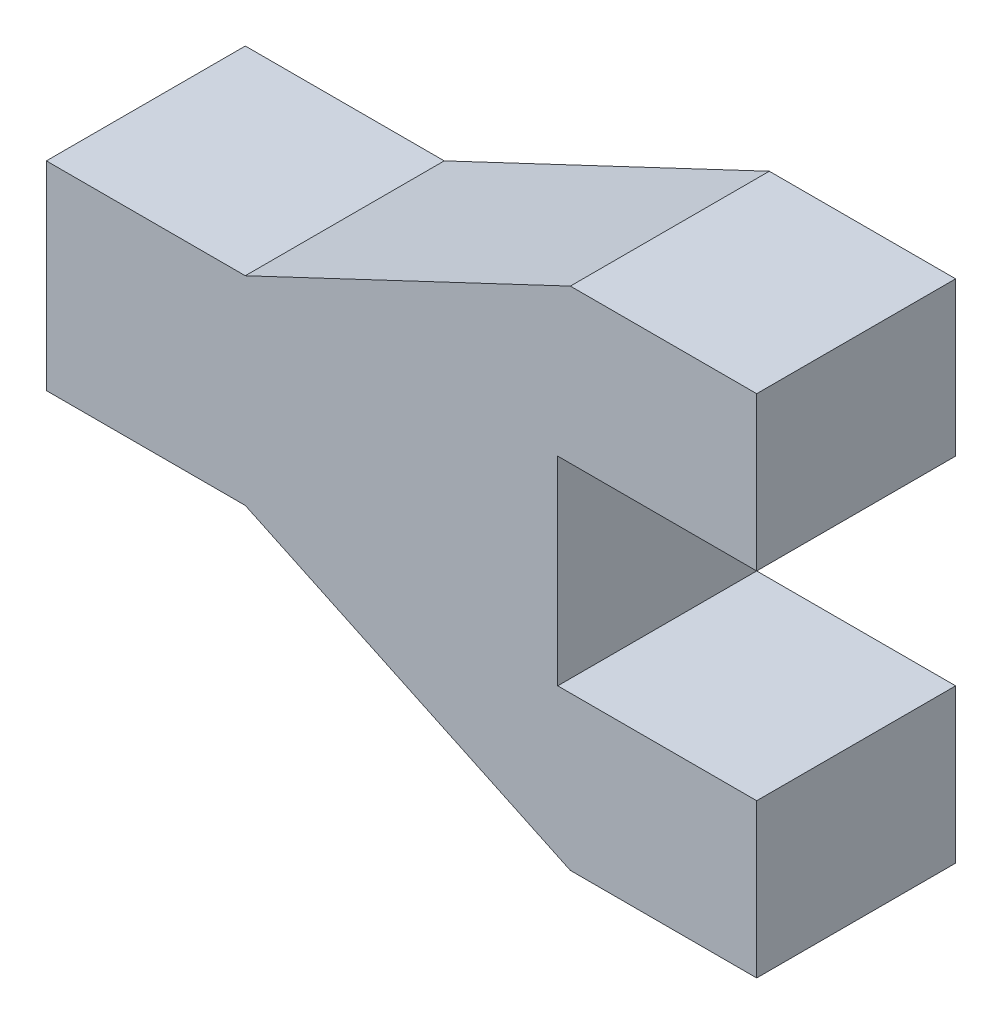
ISO-10303-21;
HEADER;
FILE_DESCRIPTION(('STEP AP214'),'2;1');
FILE_NAME('part.step','',(''),(''),'','','');
FILE_SCHEMA(('AUTOMOTIVE_DESIGN { 1 0 10303 214 1 1 1 1 }'));
ENDSEC;
DATA;
#1=APPLICATION_CONTEXT('core data for automotive mechanical design processes');
#2=APPLICATION_PROTOCOL_DEFINITION('international standard','automotive_design',2000,#1);
#3=PRODUCT_CONTEXT('',#1,'mechanical');
#4=PRODUCT('Part','Part','',(#3));
#5=PRODUCT_RELATED_PRODUCT_CATEGORY('part','',(#4));
#6=PRODUCT_DEFINITION_FORMATION('','',#4);
#7=PRODUCT_DEFINITION_CONTEXT('part definition',#1,'design');
#8=PRODUCT_DEFINITION('design','',#6,#7);
#9=PRODUCT_DEFINITION_SHAPE('','',#8);
#10=(LENGTH_UNIT() NAMED_UNIT(*) SI_UNIT(.MILLI.,.METRE.));
#11=(NAMED_UNIT(*) PLANE_ANGLE_UNIT() SI_UNIT($,.RADIAN.));
#12=(NAMED_UNIT(*) SI_UNIT($,.STERADIAN.) SOLID_ANGLE_UNIT());
#13=UNCERTAINTY_MEASURE_WITH_UNIT(LENGTH_MEASURE(1.E-05),#10,'distance_accuracy_value','');
#14=(GEOMETRIC_REPRESENTATION_CONTEXT(3) GLOBAL_UNCERTAINTY_ASSIGNED_CONTEXT((#13)) GLOBAL_UNIT_ASSIGNED_CONTEXT((#10,
#11,#12)) REPRESENTATION_CONTEXT('',''));
#15=CARTESIAN_POINT('',(0.,0.,0.));
#16=DIRECTION('',(0.,0.,1.));
#17=DIRECTION('',(1.,0.,0.));
#18=AXIS2_PLACEMENT_3D('',#15,#16,#17);
#19=CARTESIAN_POINT('',(64.9582859778661,0.,1.524));
#20=DIRECTION('',(0.,1.,0.));
#21=DIRECTION('',(0.,0.,1.));
#22=AXIS2_PLACEMENT_3D('',#19,#20,#21);
#23=PLANE('',#22);
#24=DIRECTION('',(1.,0.,0.));
#25=VECTOR('',#24,1.);
#26=CARTESIAN_POINT('',(64.9582859778661,0.,0.));
#27=LINE('',#26,#25);
#28=CARTESIAN_POINT('',(64.9582859778661,0.,0.));
#29=VERTEX_POINT('',#28);
#30=CARTESIAN_POINT('',(66.4822859778661,0.,0.));
#31=VERTEX_POINT('',#30);
#32=EDGE_CURVE('E152',#29,#31,#27,.T.);
#33=ORIENTED_EDGE('',*,*,#32,.T.);
#34=DIRECTION('',(0.,0.,-1.));
#35=VECTOR('',#34,1.);
#36=CARTESIAN_POINT('',(66.4822859778661,0.,1.524));
#37=LINE('',#36,#35);
#38=CARTESIAN_POINT('',(66.4822859778661,0.,1.524));
#39=VERTEX_POINT('',#38);
#40=EDGE_CURVE('E11',#39,#31,#37,.T.);
#41=ORIENTED_EDGE('',*,*,#40,.F.);
#42=DIRECTION('',(1.,0.,0.));
#43=VECTOR('',#42,1.);
#44=CARTESIAN_POINT('',(64.9582859778661,0.,1.524));
#45=LINE('',#44,#43);
#46=CARTESIAN_POINT('',(64.9582859778661,0.,1.524));
#47=VERTEX_POINT('',#46);
#48=EDGE_CURVE('E174',#47,#39,#45,.T.);
#49=ORIENTED_EDGE('',*,*,#48,.F.);
#50=DIRECTION('',(0.,0.,-1.));
#51=VECTOR('',#50,1.);
#52=CARTESIAN_POINT('',(64.9582859778661,0.,1.524));
#53=LINE('',#52,#51);
#54=EDGE_CURVE('E148',#47,#29,#53,.T.);
#55=ORIENTED_EDGE('',*,*,#54,.T.);
#56=EDGE_LOOP('',(#33,#41,#49,#55));
#57=FACE_BOUND('',#56,.T.);
#58=ADVANCED_FACE('F32',(#57),#23,.F.);
#59=CARTESIAN_POINT('',(66.4822859778661,0.,1.524));
#60=DIRECTION('',(-1.,0.,0.));
#61=DIRECTION('',(0.,0.,1.));
#62=AXIS2_PLACEMENT_3D('',#59,#60,#61);
#63=PLANE('',#62);
#64=DIRECTION('',(0.,1.,0.));
#65=VECTOR('',#64,1.);
#66=CARTESIAN_POINT('',(66.4822859778661,0.,0.));
#67=LINE('',#66,#65);
#68=CARTESIAN_POINT('',(66.4822859778661,1.17612480615378,0.));
#69=VERTEX_POINT('',#68);
#70=EDGE_CURVE('E155',#31,#69,#67,.T.);
#71=ORIENTED_EDGE('',*,*,#70,.T.);
#72=DIRECTION('',(0.,0.,-1.));
#73=VECTOR('',#72,1.);
#74=CARTESIAN_POINT('',(66.4822859778661,1.17612480615378,1.524));
#75=LINE('',#74,#73);
#76=CARTESIAN_POINT('',(66.4822859778661,1.17612480615378,1.524));
#77=VERTEX_POINT('',#76);
#78=EDGE_CURVE('E40',#77,#69,#75,.T.);
#79=ORIENTED_EDGE('',*,*,#78,.F.);
#80=DIRECTION('',(0.,1.,0.));
#81=VECTOR('',#80,1.);
#82=CARTESIAN_POINT('',(66.4822859778661,0.,1.524));
#83=LINE('',#82,#81);
#84=EDGE_CURVE('E103',#39,#77,#83,.T.);
#85=ORIENTED_EDGE('',*,*,#84,.F.);
#86=ORIENTED_EDGE('',*,*,#40,.T.);
#87=EDGE_LOOP('',(#71,#79,#85,#86));
#88=FACE_BOUND('',#87,.T.);
#89=ADVANCED_FACE('F252',(#88),#63,.F.);
#90=CARTESIAN_POINT('',(65.05492565956,1.17612480615378,1.524));
#91=DIRECTION('',(0.,-1.,0.));
#92=DIRECTION('',(0.,0.,-1.));
#93=AXIS2_PLACEMENT_3D('',#90,#91,#92);
#94=PLANE('',#93);
#95=DIRECTION('',(-1.,0.,0.));
#96=VECTOR('',#95,1.);
#97=CARTESIAN_POINT('',(65.05492565956,1.17612480615378,0.));
#98=LINE('',#97,#96);
#99=CARTESIAN_POINT('',(65.05492565956,1.17612480615378,0.));
#100=VERTEX_POINT('',#99);
#101=EDGE_CURVE('E157',#69,#100,#98,.T.);
#102=ORIENTED_EDGE('',*,*,#101,.T.);
#103=DIRECTION('',(0.,0.,-1.));
#104=VECTOR('',#103,1.);
#105=CARTESIAN_POINT('',(65.05492565956,1.17612480615378,1.524));
#106=LINE('',#105,#104);
#107=CARTESIAN_POINT('',(65.05492565956,1.17612480615378,1.524));
#108=VERTEX_POINT('',#107);
#109=EDGE_CURVE('E193',#108,#100,#106,.T.);
#110=ORIENTED_EDGE('',*,*,#109,.F.);
#111=DIRECTION('',(-1.,0.,0.));
#112=VECTOR('',#111,1.);
#113=CARTESIAN_POINT('',(65.05492565956,1.17612480615378,1.524));
#114=LINE('',#113,#112);
#115=EDGE_CURVE('E201',#77,#108,#114,.T.);
#116=ORIENTED_EDGE('',*,*,#115,.F.);
#117=ORIENTED_EDGE('',*,*,#78,.T.);
#118=EDGE_LOOP('',(#102,#110,#116,#117));
#119=FACE_BOUND('',#118,.T.);
#120=ADVANCED_FACE('F199',(#119),#94,.F.);
#121=CARTESIAN_POINT('',(62.5651667352737,0.,1.524));
#122=DIRECTION('',(0.427126658457203,-0.904191803565584,0.));
#123=DIRECTION('',(0.904191803565584,0.427126658457203,0.));
#124=AXIS2_PLACEMENT_3D('',#121,#122,#123);
#125=PLANE('',#124);
#126=DIRECTION('',(-0.904191803565584,-0.427126658457202,0.));
#127=VECTOR('',#126,1.);
#128=CARTESIAN_POINT('',(62.5651667352737,0.,0.));
#129=LINE('',#128,#127);
#130=CARTESIAN_POINT('',(62.5651667352737,0.,0.));
#131=VERTEX_POINT('',#130);
#132=EDGE_CURVE('E159',#100,#131,#129,.T.);
#133=ORIENTED_EDGE('',*,*,#132,.T.);
#134=DIRECTION('',(0.,0.,-1.));
#135=VECTOR('',#134,1.);
#136=CARTESIAN_POINT('',(62.5651667352737,0.,1.524));
#137=LINE('',#136,#135);
#138=CARTESIAN_POINT('',(62.5651667352737,0.,1.524));
#139=VERTEX_POINT('',#138);
#140=EDGE_CURVE('E190',#139,#131,#137,.T.);
#141=ORIENTED_EDGE('',*,*,#140,.F.);
#142=DIRECTION('',(-0.904191803565584,-0.427126658457202,0.));
#143=VECTOR('',#142,1.);
#144=CARTESIAN_POINT('',(62.5651667352737,0.,1.524));
#145=LINE('',#144,#143);
#146=EDGE_CURVE('E219',#108,#139,#145,.T.);
#147=ORIENTED_EDGE('',*,*,#146,.F.);
#148=ORIENTED_EDGE('',*,*,#109,.T.);
#149=EDGE_LOOP('',(#133,#141,#147,#148));
#150=FACE_BOUND('',#149,.T.);
#151=ADVANCED_FACE('F210',(#150),#125,.F.);
#152=CARTESIAN_POINT('',(61.0411667352737,0.,1.524));
#153=DIRECTION('',(0.,-1.,0.));
#154=DIRECTION('',(1.,0.,0.));
#155=AXIS2_PLACEMENT_3D('',#152,#153,#154);
#156=PLANE('',#155);
#157=DIRECTION('',(-1.,0.,0.));
#158=VECTOR('',#157,1.);
#159=CARTESIAN_POINT('',(61.0411667352737,0.,0.));
#160=LINE('',#159,#158);
#161=CARTESIAN_POINT('',(61.0411667352737,0.,0.));
#162=VERTEX_POINT('',#161);
#163=EDGE_CURVE('E161',#131,#162,#160,.T.);
#164=ORIENTED_EDGE('',*,*,#163,.T.);
#165=DIRECTION('',(0.,0.,-1.));
#166=VECTOR('',#165,1.);
#167=CARTESIAN_POINT('',(61.0411667352737,0.,1.524));
#168=LINE('',#167,#166);
#169=CARTESIAN_POINT('',(61.0411667352737,0.,1.524));
#170=VERTEX_POINT('',#169);
#171=EDGE_CURVE('E187',#170,#162,#168,.T.);
#172=ORIENTED_EDGE('',*,*,#171,.F.);
#173=DIRECTION('',(-1.,0.,0.));
#174=VECTOR('',#173,1.);
#175=CARTESIAN_POINT('',(61.0411667352737,0.,1.524));
#176=LINE('',#175,#174);
#177=EDGE_CURVE('E216',#139,#170,#176,.T.);
#178=ORIENTED_EDGE('',*,*,#177,.F.);
#179=ORIENTED_EDGE('',*,*,#140,.T.);
#180=EDGE_LOOP('',(#164,#172,#178,#179));
#181=FACE_BOUND('',#180,.T.);
#182=ADVANCED_FACE('F214',(#181),#156,.F.);
#183=CARTESIAN_POINT('',(61.0411667352737,-1.524,1.524));
#184=DIRECTION('',(1.,0.,0.));
#185=DIRECTION('',(0.,0.,-1.));
#186=AXIS2_PLACEMENT_3D('',#183,#184,#185);
#187=PLANE('',#186);
#188=DIRECTION('',(0.,-1.,0.));
#189=VECTOR('',#188,1.);
#190=CARTESIAN_POINT('',(61.0411667352737,-1.524,0.));
#191=LINE('',#190,#189);
#192=CARTESIAN_POINT('',(61.0411667352737,-1.524,0.));
#193=VERTEX_POINT('',#192);
#194=EDGE_CURVE('E163',#162,#193,#191,.T.);
#195=ORIENTED_EDGE('',*,*,#194,.T.);
#196=DIRECTION('',(0.,0.,-1.));
#197=VECTOR('',#196,1.);
#198=CARTESIAN_POINT('',(61.0411667352737,-1.524,1.524));
#199=LINE('',#198,#197);
#200=CARTESIAN_POINT('',(61.0411667352737,-1.524,1.524));
#201=VERTEX_POINT('',#200);
#202=EDGE_CURVE('E184',#201,#193,#199,.T.);
#203=ORIENTED_EDGE('',*,*,#202,.F.);
#204=DIRECTION('',(0.,-1.,0.));
#205=VECTOR('',#204,1.);
#206=CARTESIAN_POINT('',(61.0411667352737,-1.524,1.524));
#207=LINE('',#206,#205);
#208=EDGE_CURVE('E218',#170,#201,#207,.T.);
#209=ORIENTED_EDGE('',*,*,#208,.F.);
#210=ORIENTED_EDGE('',*,*,#171,.T.);
#211=EDGE_LOOP('',(#195,#203,#209,#210));
#212=FACE_BOUND('',#211,.T.);
#213=ADVANCED_FACE('F265',(#212),#187,.F.);
#214=CARTESIAN_POINT('',(61.0411667352737,-1.524,1.524));
#215=DIRECTION('',(0.,1.,0.));
#216=DIRECTION('',(-1.,0.,0.));
#217=AXIS2_PLACEMENT_3D('',#214,#215,#216);
#218=PLANE('',#217);
#219=DIRECTION('',(1.,0.,0.));
#220=VECTOR('',#219,1.);
#221=CARTESIAN_POINT('',(61.0411667352737,-1.524,0.));
#222=LINE('',#221,#220);
#223=CARTESIAN_POINT('',(62.5651667352737,-1.524,0.));
#224=VERTEX_POINT('',#223);
#225=EDGE_CURVE('E165',#193,#224,#222,.T.);
#226=ORIENTED_EDGE('',*,*,#225,.T.);
#227=DIRECTION('',(0.,0.,-1.));
#228=VECTOR('',#227,1.);
#229=CARTESIAN_POINT('',(62.5651667352737,-1.524,1.524));
#230=LINE('',#229,#228);
#231=CARTESIAN_POINT('',(62.5651667352737,-1.524,1.524));
#232=VERTEX_POINT('',#231);
#233=EDGE_CURVE('E181',#232,#224,#230,.T.);
#234=ORIENTED_EDGE('',*,*,#233,.F.);
#235=DIRECTION('',(1.,0.,0.));
#236=VECTOR('',#235,1.);
#237=CARTESIAN_POINT('',(61.0411667352737,-1.524,1.524));
#238=LINE('',#237,#236);
#239=EDGE_CURVE('E221',#201,#232,#238,.T.);
#240=ORIENTED_EDGE('',*,*,#239,.F.);
#241=ORIENTED_EDGE('',*,*,#202,.T.);
#242=EDGE_LOOP('',(#226,#234,#240,#241));
#243=FACE_BOUND('',#242,.T.);
#244=ADVANCED_FACE('F268',(#243),#218,.F.);
#245=CARTESIAN_POINT('',(62.5651667352737,-1.524,1.524));
#246=DIRECTION('',(0.427126658457203,0.904191803565584,0.));
#247=DIRECTION('',(-0.904191803565584,0.427126658457203,0.));
#248=AXIS2_PLACEMENT_3D('',#245,#246,#247);
#249=PLANE('',#248);
#250=DIRECTION('',(0.904191803565584,-0.427126658457202,0.));
#251=VECTOR('',#250,1.);
#252=CARTESIAN_POINT('',(62.5651667352737,-1.524,0.));
#253=LINE('',#252,#251);
#254=CARTESIAN_POINT('',(65.05492565956,-2.70012480615378,0.));
#255=VERTEX_POINT('',#254);
#256=EDGE_CURVE('E167',#224,#255,#253,.T.);
#257=ORIENTED_EDGE('',*,*,#256,.T.);
#258=DIRECTION('',(0.,0.,-1.));
#259=VECTOR('',#258,1.);
#260=CARTESIAN_POINT('',(65.05492565956,-2.70012480615378,1.524));
#261=LINE('',#260,#259);
#262=CARTESIAN_POINT('',(65.05492565956,-2.70012480615378,1.524));
#263=VERTEX_POINT('',#262);
#264=EDGE_CURVE('E178',#263,#255,#261,.T.);
#265=ORIENTED_EDGE('',*,*,#264,.F.);
#266=DIRECTION('',(0.904191803565584,-0.427126658457202,0.));
#267=VECTOR('',#266,1.);
#268=CARTESIAN_POINT('',(62.5651667352737,-1.524,1.524));
#269=LINE('',#268,#267);
#270=EDGE_CURVE('E227',#232,#263,#269,.T.);
#271=ORIENTED_EDGE('',*,*,#270,.F.);
#272=ORIENTED_EDGE('',*,*,#233,.T.);
#273=EDGE_LOOP('',(#257,#265,#271,#272));
#274=FACE_BOUND('',#273,.T.);
#275=ADVANCED_FACE('F233',(#274),#249,.F.);
#276=CARTESIAN_POINT('',(65.05492565956,-2.70012480615378,1.524));
#277=DIRECTION('',(0.,1.,0.));
#278=DIRECTION('',(0.,0.,1.));
#279=AXIS2_PLACEMENT_3D('',#276,#277,#278);
#280=PLANE('',#279);
#281=DIRECTION('',(1.,0.,0.));
#282=VECTOR('',#281,1.);
#283=CARTESIAN_POINT('',(65.05492565956,-2.70012480615378,0.));
#284=LINE('',#283,#282);
#285=CARTESIAN_POINT('',(66.4822859778661,-2.70012480615378,0.));
#286=VERTEX_POINT('',#285);
#287=EDGE_CURVE('E169',#255,#286,#284,.T.);
#288=ORIENTED_EDGE('',*,*,#287,.T.);
#289=DIRECTION('',(0.,0.,-1.));
#290=VECTOR('',#289,1.);
#291=CARTESIAN_POINT('',(66.4822859778661,-2.70012480615378,1.524));
#292=LINE('',#291,#290);
#293=CARTESIAN_POINT('',(66.4822859778661,-2.70012480615378,1.524));
#294=VERTEX_POINT('',#293);
#295=EDGE_CURVE('E143',#294,#286,#292,.T.);
#296=ORIENTED_EDGE('',*,*,#295,.F.);
#297=DIRECTION('',(1.,0.,0.));
#298=VECTOR('',#297,1.);
#299=CARTESIAN_POINT('',(65.05492565956,-2.70012480615378,1.524));
#300=LINE('',#299,#298);
#301=EDGE_CURVE('E134',#263,#294,#300,.T.);
#302=ORIENTED_EDGE('',*,*,#301,.F.);
#303=ORIENTED_EDGE('',*,*,#264,.T.);
#304=EDGE_LOOP('',(#288,#296,#302,#303));
#305=FACE_BOUND('',#304,.T.);
#306=ADVANCED_FACE('F237',(#305),#280,.F.);
#307=CARTESIAN_POINT('',(66.4822859778661,-1.524,1.524));
#308=DIRECTION('',(-1.,0.,0.));
#309=DIRECTION('',(0.,0.,1.));
#310=AXIS2_PLACEMENT_3D('',#307,#308,#309);
#311=PLANE('',#310);
#312=DIRECTION('',(0.,1.,0.));
#313=VECTOR('',#312,1.);
#314=CARTESIAN_POINT('',(66.4822859778661,-1.524,0.));
#315=LINE('',#314,#313);
#316=CARTESIAN_POINT('',(66.4822859778661,-1.524,0.));
#317=VERTEX_POINT('',#316);
#318=EDGE_CURVE('E142',#286,#317,#315,.T.);
#319=ORIENTED_EDGE('',*,*,#318,.T.);
#320=DIRECTION('',(0.,0.,-1.));
#321=VECTOR('',#320,1.);
#322=CARTESIAN_POINT('',(66.4822859778661,-1.524,1.524));
#323=LINE('',#322,#321);
#324=CARTESIAN_POINT('',(66.4822859778661,-1.524,1.524));
#325=VERTEX_POINT('',#324);
#326=EDGE_CURVE('E139',#325,#317,#323,.T.);
#327=ORIENTED_EDGE('',*,*,#326,.F.);
#328=DIRECTION('',(0.,1.,0.));
#329=VECTOR('',#328,1.);
#330=CARTESIAN_POINT('',(66.4822859778661,-1.524,1.524));
#331=LINE('',#330,#329);
#332=EDGE_CURVE('E128',#294,#325,#331,.T.);
#333=ORIENTED_EDGE('',*,*,#332,.F.);
#334=ORIENTED_EDGE('',*,*,#295,.T.);
#335=EDGE_LOOP('',(#319,#327,#333,#334));
#336=FACE_BOUND('',#335,.T.);
#337=ADVANCED_FACE('F140',(#336),#311,.F.);
#338=CARTESIAN_POINT('',(64.9582859778661,-1.524,1.524));
#339=DIRECTION('',(0.,-1.,0.));
#340=DIRECTION('',(0.,0.,-1.));
#341=AXIS2_PLACEMENT_3D('',#338,#339,#340);
#342=PLANE('',#341);
#343=DIRECTION('',(-1.,0.,0.));
#344=VECTOR('',#343,1.);
#345=CARTESIAN_POINT('',(64.9582859778661,-1.524,0.));
#346=LINE('',#345,#344);
#347=CARTESIAN_POINT('',(64.9582859778661,-1.524,0.));
#348=VERTEX_POINT('',#347);
#349=EDGE_CURVE('E89',#317,#348,#346,.T.);
#350=ORIENTED_EDGE('',*,*,#349,.T.);
#351=DIRECTION('',(0.,0.,-1.));
#352=VECTOR('',#351,1.);
#353=CARTESIAN_POINT('',(64.9582859778661,-1.524,1.524));
#354=LINE('',#353,#352);
#355=CARTESIAN_POINT('',(64.9582859778661,-1.524,1.524));
#356=VERTEX_POINT('',#355);
#357=EDGE_CURVE('E144',#356,#348,#354,.T.);
#358=ORIENTED_EDGE('',*,*,#357,.F.);
#359=DIRECTION('',(-1.,0.,0.));
#360=VECTOR('',#359,1.);
#361=CARTESIAN_POINT('',(64.9582859778661,-1.524,1.524));
#362=LINE('',#361,#360);
#363=EDGE_CURVE('E132',#325,#356,#362,.T.);
#364=ORIENTED_EDGE('',*,*,#363,.F.);
#365=ORIENTED_EDGE('',*,*,#326,.T.);
#366=EDGE_LOOP('',(#350,#358,#364,#365));
#367=FACE_BOUND('',#366,.T.);
#368=ADVANCED_FACE('F146',(#367),#342,.F.);
#369=CARTESIAN_POINT('',(64.9582859778661,0.,1.524));
#370=DIRECTION('',(-1.,0.,0.));
#371=DIRECTION('',(0.,0.,1.));
#372=AXIS2_PLACEMENT_3D('',#369,#370,#371);
#373=PLANE('',#372);
#374=DIRECTION('',(0.,1.,0.));
#375=VECTOR('',#374,1.);
#376=CARTESIAN_POINT('',(64.9582859778661,0.,0.));
#377=LINE('',#376,#375);
#378=EDGE_CURVE('E95',#348,#29,#377,.T.);
#379=ORIENTED_EDGE('',*,*,#378,.T.);
#380=ORIENTED_EDGE('',*,*,#54,.F.);
#381=DIRECTION('',(0.,1.,0.));
#382=VECTOR('',#381,1.);
#383=CARTESIAN_POINT('',(64.9582859778661,0.,1.524));
#384=LINE('',#383,#382);
#385=EDGE_CURVE('E48',#356,#47,#384,.T.);
#386=ORIENTED_EDGE('',*,*,#385,.F.);
#387=ORIENTED_EDGE('',*,*,#357,.T.);
#388=EDGE_LOOP('',(#379,#380,#386,#387));
#389=FACE_BOUND('',#388,.T.);
#390=ADVANCED_FACE('F241',(#389),#373,.F.);
#391=CARTESIAN_POINT('',(0.,0.,1.524));
#392=DIRECTION('',(0.,0.,1.));
#393=DIRECTION('',(1.,0.,0.));
#394=AXIS2_PLACEMENT_3D('',#391,#392,#393);
#395=PLANE('',#394);
#396=ORIENTED_EDGE('',*,*,#48,.T.);
#397=ORIENTED_EDGE('',*,*,#84,.T.);
#398=ORIENTED_EDGE('',*,*,#115,.T.);
#399=ORIENTED_EDGE('',*,*,#146,.T.);
#400=ORIENTED_EDGE('',*,*,#177,.T.);
#401=ORIENTED_EDGE('',*,*,#208,.T.);
#402=ORIENTED_EDGE('',*,*,#239,.T.);
#403=ORIENTED_EDGE('',*,*,#270,.T.);
#404=ORIENTED_EDGE('',*,*,#301,.T.);
#405=ORIENTED_EDGE('',*,*,#332,.T.);
#406=ORIENTED_EDGE('',*,*,#363,.T.);
#407=ORIENTED_EDGE('',*,*,#385,.T.);
#408=EDGE_LOOP('',(#396,#397,#398,#399,#400,#401,#402,#403,#404,#405,#406,#407));
#409=FACE_BOUND('',#408,.T.);
#410=ADVANCED_FACE('F130',(#409),#395,.T.);
#411=CARTESIAN_POINT('',(0.,0.,0.));
#412=DIRECTION('',(0.,0.,1.));
#413=DIRECTION('',(1.,0.,0.));
#414=AXIS2_PLACEMENT_3D('',#411,#412,#413);
#415=PLANE('',#414);
#416=ORIENTED_EDGE('',*,*,#32,.F.);
#417=ORIENTED_EDGE('',*,*,#378,.F.);
#418=ORIENTED_EDGE('',*,*,#349,.F.);
#419=ORIENTED_EDGE('',*,*,#318,.F.);
#420=ORIENTED_EDGE('',*,*,#287,.F.);
#421=ORIENTED_EDGE('',*,*,#256,.F.);
#422=ORIENTED_EDGE('',*,*,#225,.F.);
#423=ORIENTED_EDGE('',*,*,#194,.F.);
#424=ORIENTED_EDGE('',*,*,#163,.F.);
#425=ORIENTED_EDGE('',*,*,#132,.F.);
#426=ORIENTED_EDGE('',*,*,#101,.F.);
#427=ORIENTED_EDGE('',*,*,#70,.F.);
#428=EDGE_LOOP('',(#416,#417,#418,#419,#420,#421,#422,#423,#424,#425,#426,#427));
#429=FACE_BOUND('',#428,.T.);
#430=ADVANCED_FACE('F205',(#429),#415,.F.);
#431=CLOSED_SHELL('',(#58,#89,#120,#151,#182,#213,#244,#275,#306,#337,#368,#390,#410,#430));
#432=MANIFOLD_SOLID_BREP('B2',#431);
#433=ADVANCED_BREP_SHAPE_REPRESENTATION('',(#18,#432),#14);
#434=SHAPE_DEFINITION_REPRESENTATION(#9,#433);
ENDSEC;
END-ISO-10303-21;
